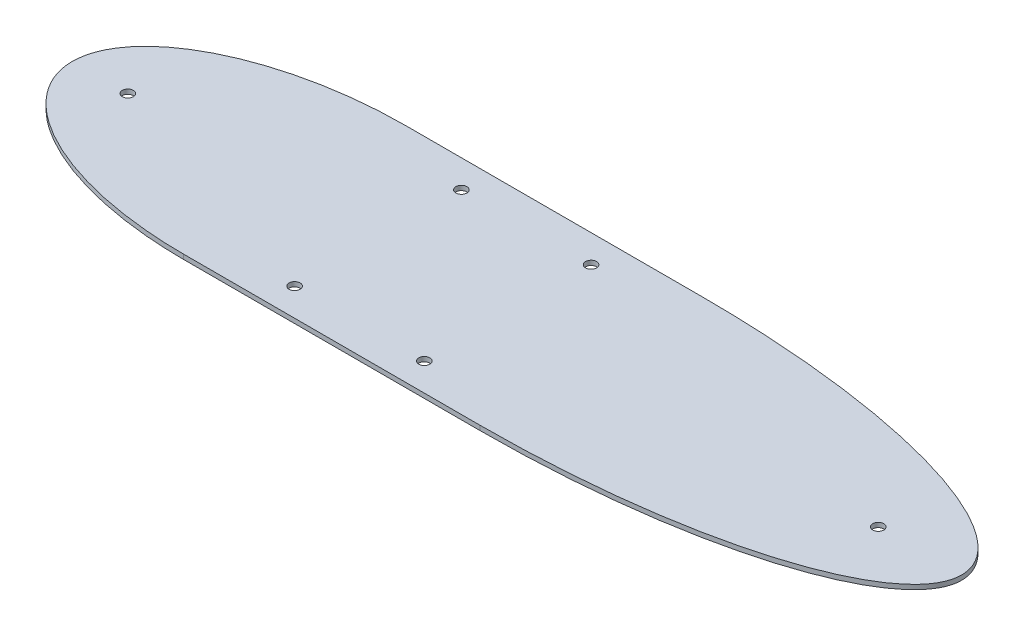
ISO-10303-21;
HEADER;
FILE_DESCRIPTION(('STEP AP214'),'2;1');
FILE_NAME('part.step','',(''),(''),'','','');
FILE_SCHEMA(('AUTOMOTIVE_DESIGN { 1 0 10303 214 1 1 1 1 }'));
ENDSEC;
DATA;
#1=APPLICATION_CONTEXT('core data for automotive mechanical design processes');
#2=APPLICATION_PROTOCOL_DEFINITION('international standard','automotive_design',2000,#1);
#3=PRODUCT_CONTEXT('',#1,'mechanical');
#4=PRODUCT('Part','Part','',(#3));
#5=PRODUCT_RELATED_PRODUCT_CATEGORY('part','',(#4));
#6=PRODUCT_DEFINITION_FORMATION('','',#4);
#7=PRODUCT_DEFINITION_CONTEXT('part definition',#1,'design');
#8=PRODUCT_DEFINITION('design','',#6,#7);
#9=PRODUCT_DEFINITION_SHAPE('','',#8);
#10=(LENGTH_UNIT() NAMED_UNIT(*) SI_UNIT(.MILLI.,.METRE.));
#11=(NAMED_UNIT(*) PLANE_ANGLE_UNIT() SI_UNIT($,.RADIAN.));
#12=(NAMED_UNIT(*) SI_UNIT($,.STERADIAN.) SOLID_ANGLE_UNIT());
#13=UNCERTAINTY_MEASURE_WITH_UNIT(LENGTH_MEASURE(1.E-05),#10,'distance_accuracy_value','');
#14=(GEOMETRIC_REPRESENTATION_CONTEXT(3) GLOBAL_UNCERTAINTY_ASSIGNED_CONTEXT((#13)) GLOBAL_UNIT_ASSIGNED_CONTEXT((#10,
#11,#12)) REPRESENTATION_CONTEXT('',''));
#15=CARTESIAN_POINT('',(0.,0.,0.));
#16=DIRECTION('',(0.,0.,1.));
#17=DIRECTION('',(1.,0.,0.));
#18=AXIS2_PLACEMENT_3D('',#15,#16,#17);
#19=CARTESIAN_POINT('',(177.8,1.5875,38.1));
#20=CARTESIAN_POINT('',(431.8,1.5875,38.1));
#21=CARTESIAN_POINT('',(431.8,1.5875,-38.1));
#22=CARTESIAN_POINT('',(177.8,1.5875,-38.1));
#23=(BOUNDED_CURVE() B_SPLINE_CURVE(3,(#19,#20,#21,#22),.UNSPECIFIED.,.F.,
.F.) B_SPLINE_CURVE_WITH_KNOTS((4,4),(0.,1.),
.UNSPECIFIED.) CURVE() GEOMETRIC_REPRESENTATION_ITEM() RATIONAL_B_SPLINE_CURVE((1.,
0.333333333333333,0.333333333333333,1.)) REPRESENTATION_ITEM(''));
#24=DIRECTION('',(0.,-1.,0.));
#25=VECTOR('',#24,1.);
#26=SURFACE_OF_LINEAR_EXTRUSION('',#23,#25);
#27=CARTESIAN_POINT('',(177.8,0.,38.1));
#28=CARTESIAN_POINT('',(431.8,0.,38.1));
#29=CARTESIAN_POINT('',(431.8,0.,-38.1));
#30=CARTESIAN_POINT('',(177.8,0.,-38.1));
#31=(BOUNDED_CURVE() B_SPLINE_CURVE(3,(#27,#28,#29,#30),.UNSPECIFIED.,.F.,
.F.) B_SPLINE_CURVE_WITH_KNOTS((4,4),(0.,1.),
.UNSPECIFIED.) CURVE() GEOMETRIC_REPRESENTATION_ITEM() RATIONAL_B_SPLINE_CURVE((1.,
0.333333333333333,0.333333333333333,1.)) REPRESENTATION_ITEM(''));
#32=CARTESIAN_POINT('',(177.8,0.,38.1));
#33=VERTEX_POINT('',#32);
#34=CARTESIAN_POINT('',(177.8,0.,-38.1));
#35=VERTEX_POINT('',#34);
#36=EDGE_CURVE('E127',#33,#35,#31,.T.);
#37=ORIENTED_EDGE('',*,*,#36,.T.);
#38=DIRECTION('',(0.,-1.,0.));
#39=VECTOR('',#38,1.);
#40=CARTESIAN_POINT('',(177.8,1.5875,-38.1));
#41=LINE('',#40,#39);
#42=CARTESIAN_POINT('',(177.8,1.5875,-38.1));
#43=VERTEX_POINT('',#42);
#44=EDGE_CURVE('E11',#43,#35,#41,.T.);
#45=ORIENTED_EDGE('',*,*,#44,.F.);
#46=CARTESIAN_POINT('',(177.8,1.5875,38.1));
#47=VERTEX_POINT('',#46);
#48=EDGE_CURVE('E92',#47,#43,#23,.T.);
#49=ORIENTED_EDGE('',*,*,#48,.F.);
#50=DIRECTION('',(0.,-1.,0.));
#51=VECTOR('',#50,1.);
#52=CARTESIAN_POINT('',(177.8,1.5875,38.1));
#53=LINE('',#52,#51);
#54=EDGE_CURVE('E104',#47,#33,#53,.T.);
#55=ORIENTED_EDGE('',*,*,#54,.T.);
#56=EDGE_LOOP('',(#37,#45,#49,#55));
#57=FACE_BOUND('',#56,.T.);
#58=ADVANCED_FACE('F39',(#57),#26,.F.);
#59=CARTESIAN_POINT('',(177.8,1.5875,-38.1));
#60=DIRECTION('',(0.,0.,1.));
#61=DIRECTION('',(1.,0.,0.));
#62=AXIS2_PLACEMENT_3D('',#59,#60,#61);
#63=PLANE('',#62);
#64=DIRECTION('',(-1.,0.,0.));
#65=VECTOR('',#64,1.);
#66=CARTESIAN_POINT('',(177.8,0.,-38.1));
#67=LINE('',#66,#65);
#68=CARTESIAN_POINT('',(76.1999999999997,0.,-38.1));
#69=VERTEX_POINT('',#68);
#70=EDGE_CURVE('E97',#35,#69,#67,.T.);
#71=ORIENTED_EDGE('',*,*,#70,.T.);
#72=DIRECTION('',(0.,-1.,0.));
#73=VECTOR('',#72,1.);
#74=CARTESIAN_POINT('',(76.1999999999997,1.5875,-38.1));
#75=LINE('',#74,#73);
#76=CARTESIAN_POINT('',(76.1999999999997,1.5875,-38.1));
#77=VERTEX_POINT('',#76);
#78=EDGE_CURVE('E49',#77,#69,#75,.T.);
#79=ORIENTED_EDGE('',*,*,#78,.F.);
#80=DIRECTION('',(-1.,0.,0.));
#81=VECTOR('',#80,1.);
#82=CARTESIAN_POINT('',(177.8,1.5875,-38.1));
#83=LINE('',#82,#81);
#84=EDGE_CURVE('E87',#43,#77,#83,.T.);
#85=ORIENTED_EDGE('',*,*,#84,.F.);
#86=ORIENTED_EDGE('',*,*,#44,.T.);
#87=EDGE_LOOP('',(#71,#79,#85,#86));
#88=FACE_BOUND('',#87,.T.);
#89=ADVANCED_FACE('F96',(#88),#63,.F.);
#90=CARTESIAN_POINT('',(76.1999999999997,1.5875,-38.1));
#91=CARTESIAN_POINT('',(-76.1999999999984,1.5875,-38.0999999999997));
#92=CARTESIAN_POINT('',(-76.1999999999984,1.5875,38.0999999999997));
#93=CARTESIAN_POINT('',(76.1999999999997,1.5875,38.1));
#94=(BOUNDED_CURVE() B_SPLINE_CURVE(3,(#90,#91,#92,#93),.UNSPECIFIED.,.F.,
.F.) B_SPLINE_CURVE_WITH_KNOTS((4,4),(0.,1.),
.UNSPECIFIED.) CURVE() GEOMETRIC_REPRESENTATION_ITEM() RATIONAL_B_SPLINE_CURVE((1.,
0.333333333333335,0.333333333333335,1.)) REPRESENTATION_ITEM(''));
#95=DIRECTION('',(0.,-1.,0.));
#96=VECTOR('',#95,1.);
#97=SURFACE_OF_LINEAR_EXTRUSION('',#94,#96);
#98=CARTESIAN_POINT('',(76.1999999999997,0.,-38.1));
#99=CARTESIAN_POINT('',(-76.1999999999984,0.,-38.0999999999997));
#100=CARTESIAN_POINT('',(-76.1999999999984,0.,38.0999999999997));
#101=CARTESIAN_POINT('',(76.1999999999997,0.,38.1));
#102=(BOUNDED_CURVE() B_SPLINE_CURVE(3,(#98,#99,#100,#101),.UNSPECIFIED.,.F.,
.F.) B_SPLINE_CURVE_WITH_KNOTS((4,4),(0.,1.),
.UNSPECIFIED.) CURVE() GEOMETRIC_REPRESENTATION_ITEM() RATIONAL_B_SPLINE_CURVE((1.,
0.333333333333335,0.333333333333335,1.)) REPRESENTATION_ITEM(''));
#103=CARTESIAN_POINT('',(76.1999999999997,0.,38.1));
#104=VERTEX_POINT('',#103);
#105=EDGE_CURVE('E74',#69,#104,#102,.T.);
#106=ORIENTED_EDGE('',*,*,#105,.T.);
#107=DIRECTION('',(0.,-1.,0.));
#108=VECTOR('',#107,1.);
#109=CARTESIAN_POINT('',(76.1999999999997,1.5875,38.1));
#110=LINE('',#109,#108);
#111=CARTESIAN_POINT('',(76.1999999999997,1.5875,38.1));
#112=VERTEX_POINT('',#111);
#113=EDGE_CURVE('E99',#112,#104,#110,.T.);
#114=ORIENTED_EDGE('',*,*,#113,.F.);
#115=EDGE_CURVE('E90',#77,#112,#94,.T.);
#116=ORIENTED_EDGE('',*,*,#115,.F.);
#117=ORIENTED_EDGE('',*,*,#78,.T.);
#118=EDGE_LOOP('',(#106,#114,#116,#117));
#119=FACE_BOUND('',#118,.T.);
#120=ADVANCED_FACE('F100',(#119),#97,.F.);
#121=CARTESIAN_POINT('',(76.1999999999997,1.5875,38.1));
#122=DIRECTION('',(0.,0.,-1.));
#123=DIRECTION('',(-1.,0.,0.));
#124=AXIS2_PLACEMENT_3D('',#121,#122,#123);
#125=PLANE('',#124);
#126=DIRECTION('',(1.,0.,0.));
#127=VECTOR('',#126,1.);
#128=CARTESIAN_POINT('',(76.1999999999997,0.,38.1));
#129=LINE('',#128,#127);
#130=EDGE_CURVE('E80',#104,#33,#129,.T.);
#131=ORIENTED_EDGE('',*,*,#130,.T.);
#132=ORIENTED_EDGE('',*,*,#54,.F.);
#133=DIRECTION('',(1.,0.,0.));
#134=VECTOR('',#133,1.);
#135=CARTESIAN_POINT('',(76.1999999999997,1.5875,38.1));
#136=LINE('',#135,#134);
#137=EDGE_CURVE('E57',#112,#47,#136,.T.);
#138=ORIENTED_EDGE('',*,*,#137,.F.);
#139=ORIENTED_EDGE('',*,*,#113,.T.);
#140=EDGE_LOOP('',(#131,#132,#138,#139));
#141=FACE_BOUND('',#140,.T.);
#142=ADVANCED_FACE('F116',(#141),#125,.F.);
#143=CARTESIAN_POINT('',(304.8,1.5875,0.));
#144=DIRECTION('',(0.,-1.,0.));
#145=DIRECTION('',(0.,0.,-1.));
#146=AXIS2_PLACEMENT_3D('',#143,#144,#145);
#147=PLANE('',#146);
#148=CARTESIAN_POINT('',(276.225,1.5875,0.));
#149=DIRECTION('',(0.,-1.,0.));
#150=DIRECTION('',(0.,0.,-1.));
#151=AXIS2_PLACEMENT_3D('',#148,#149,#150);
#152=CIRCLE('',#151,1.89865);
#153=CARTESIAN_POINT('',(276.225,1.5875,-1.89865));
#154=VERTEX_POINT('',#153);
#155=EDGE_CURVE('E196',#154,#154,#152,.T.);
#156=ORIENTED_EDGE('',*,*,#155,.T.);
#157=EDGE_LOOP('',(#156));
#158=FACE_BOUND('',#157,.T.);
#159=CARTESIAN_POINT('',(19.05,1.5875,0.));
#160=DIRECTION('',(0.,-1.,0.));
#161=DIRECTION('',(0.,0.,-1.));
#162=AXIS2_PLACEMENT_3D('',#159,#160,#161);
#163=CIRCLE('',#162,1.89865);
#164=CARTESIAN_POINT('',(19.05,1.5875,-1.89865));
#165=VERTEX_POINT('',#164);
#166=EDGE_CURVE('E203',#165,#165,#163,.T.);
#167=ORIENTED_EDGE('',*,*,#166,.T.);
#168=EDGE_LOOP('',(#167));
#169=FACE_BOUND('',#168,.T.);
#170=CARTESIAN_POINT('',(104.775,1.5875,28.575));
#171=DIRECTION('',(0.,-1.,0.));
#172=DIRECTION('',(0.,0.,-1.));
#173=AXIS2_PLACEMENT_3D('',#170,#171,#172);
#174=CIRCLE('',#173,1.89865);
#175=CARTESIAN_POINT('',(104.775,1.5875,26.67635));
#176=VERTEX_POINT('',#175);
#177=EDGE_CURVE('E214',#176,#176,#174,.T.);
#178=ORIENTED_EDGE('',*,*,#177,.T.);
#179=EDGE_LOOP('',(#178));
#180=FACE_BOUND('',#179,.T.);
#181=CARTESIAN_POINT('',(149.225,1.5875,28.575));
#182=DIRECTION('',(0.,-1.,0.));
#183=DIRECTION('',(0.,0.,-1.));
#184=AXIS2_PLACEMENT_3D('',#181,#182,#183);
#185=CIRCLE('',#184,1.89865);
#186=CARTESIAN_POINT('',(149.225,1.5875,26.67635));
#187=VERTEX_POINT('',#186);
#188=EDGE_CURVE('E222',#187,#187,#185,.T.);
#189=ORIENTED_EDGE('',*,*,#188,.T.);
#190=EDGE_LOOP('',(#189));
#191=FACE_BOUND('',#190,.T.);
#192=CARTESIAN_POINT('',(149.225,1.5875,-28.575));
#193=DIRECTION('',(0.,-1.,0.));
#194=DIRECTION('',(0.,0.,-1.));
#195=AXIS2_PLACEMENT_3D('',#192,#193,#194);
#196=CIRCLE('',#195,1.89865);
#197=CARTESIAN_POINT('',(149.225,1.5875,-30.47365));
#198=VERTEX_POINT('',#197);
#199=EDGE_CURVE('E230',#198,#198,#196,.T.);
#200=ORIENTED_EDGE('',*,*,#199,.T.);
#201=EDGE_LOOP('',(#200));
#202=FACE_BOUND('',#201,.T.);
#203=CARTESIAN_POINT('',(104.775,1.5875,-28.575));
#204=DIRECTION('',(0.,-1.,0.));
#205=DIRECTION('',(0.,0.,-1.));
#206=AXIS2_PLACEMENT_3D('',#203,#204,#205);
#207=CIRCLE('',#206,1.89865);
#208=CARTESIAN_POINT('',(104.775,1.5875,-30.47365));
#209=VERTEX_POINT('',#208);
#210=EDGE_CURVE('E130',#209,#209,#207,.T.);
#211=ORIENTED_EDGE('',*,*,#210,.T.);
#212=EDGE_LOOP('',(#211));
#213=FACE_BOUND('',#212,.T.);
#214=ORIENTED_EDGE('',*,*,#48,.T.);
#215=ORIENTED_EDGE('',*,*,#84,.T.);
#216=ORIENTED_EDGE('',*,*,#115,.T.);
#217=ORIENTED_EDGE('',*,*,#137,.T.);
#218=EDGE_LOOP('',(#214,#215,#216,#217));
#219=FACE_BOUND('',#218,.T.);
#220=ADVANCED_FACE('F88',(#158,#169,#180,#191,#202,#213,#219),#147,.F.);
#221=CARTESIAN_POINT('',(304.8,0.,0.));
#222=DIRECTION('',(0.,-1.,0.));
#223=DIRECTION('',(0.,0.,-1.));
#224=AXIS2_PLACEMENT_3D('',#221,#222,#223);
#225=PLANE('',#224);
#226=CARTESIAN_POINT('',(276.225,0.,0.));
#227=DIRECTION('',(0.,-1.,0.));
#228=DIRECTION('',(0.,0.,-1.));
#229=AXIS2_PLACEMENT_3D('',#226,#227,#228);
#230=CIRCLE('',#229,1.89865);
#231=CARTESIAN_POINT('',(276.225,0.,-1.89865));
#232=VERTEX_POINT('',#231);
#233=EDGE_CURVE('E193',#232,#232,#230,.T.);
#234=ORIENTED_EDGE('',*,*,#233,.F.);
#235=EDGE_LOOP('',(#234));
#236=FACE_BOUND('',#235,.T.);
#237=CARTESIAN_POINT('',(19.05,0.,0.));
#238=DIRECTION('',(0.,-1.,0.));
#239=DIRECTION('',(0.,0.,-1.));
#240=AXIS2_PLACEMENT_3D('',#237,#238,#239);
#241=CIRCLE('',#240,1.89865);
#242=CARTESIAN_POINT('',(19.05,0.,-1.89865));
#243=VERTEX_POINT('',#242);
#244=EDGE_CURVE('E198',#243,#243,#241,.T.);
#245=ORIENTED_EDGE('',*,*,#244,.F.);
#246=EDGE_LOOP('',(#245));
#247=FACE_BOUND('',#246,.T.);
#248=CARTESIAN_POINT('',(104.775,0.,28.575));
#249=DIRECTION('',(0.,-1.,0.));
#250=DIRECTION('',(0.,0.,-1.));
#251=AXIS2_PLACEMENT_3D('',#248,#249,#250);
#252=CIRCLE('',#251,1.89865);
#253=CARTESIAN_POINT('',(104.775,0.,26.67635));
#254=VERTEX_POINT('',#253);
#255=EDGE_CURVE('E210',#254,#254,#252,.T.);
#256=ORIENTED_EDGE('',*,*,#255,.F.);
#257=EDGE_LOOP('',(#256));
#258=FACE_BOUND('',#257,.T.);
#259=CARTESIAN_POINT('',(149.225,0.,28.575));
#260=DIRECTION('',(0.,-1.,0.));
#261=DIRECTION('',(0.,0.,-1.));
#262=AXIS2_PLACEMENT_3D('',#259,#260,#261);
#263=CIRCLE('',#262,1.89865);
#264=CARTESIAN_POINT('',(149.225,0.,26.67635));
#265=VERTEX_POINT('',#264);
#266=EDGE_CURVE('E218',#265,#265,#263,.T.);
#267=ORIENTED_EDGE('',*,*,#266,.F.);
#268=EDGE_LOOP('',(#267));
#269=FACE_BOUND('',#268,.T.);
#270=CARTESIAN_POINT('',(149.225,0.,-28.575));
#271=DIRECTION('',(0.,-1.,0.));
#272=DIRECTION('',(0.,0.,-1.));
#273=AXIS2_PLACEMENT_3D('',#270,#271,#272);
#274=CIRCLE('',#273,1.89865);
#275=CARTESIAN_POINT('',(149.225,0.,-30.47365));
#276=VERTEX_POINT('',#275);
#277=EDGE_CURVE('E226',#276,#276,#274,.T.);
#278=ORIENTED_EDGE('',*,*,#277,.F.);
#279=EDGE_LOOP('',(#278));
#280=FACE_BOUND('',#279,.T.);
#281=CARTESIAN_POINT('',(104.775,0.,-28.575));
#282=DIRECTION('',(0.,-1.,0.));
#283=DIRECTION('',(0.,0.,-1.));
#284=AXIS2_PLACEMENT_3D('',#281,#282,#283);
#285=CIRCLE('',#284,1.89865);
#286=CARTESIAN_POINT('',(104.775,0.,-30.47365));
#287=VERTEX_POINT('',#286);
#288=EDGE_CURVE('E135',#287,#287,#285,.T.);
#289=ORIENTED_EDGE('',*,*,#288,.F.);
#290=EDGE_LOOP('',(#289));
#291=FACE_BOUND('',#290,.T.);
#292=ORIENTED_EDGE('',*,*,#36,.F.);
#293=ORIENTED_EDGE('',*,*,#130,.F.);
#294=ORIENTED_EDGE('',*,*,#105,.F.);
#295=ORIENTED_EDGE('',*,*,#70,.F.);
#296=EDGE_LOOP('',(#292,#293,#294,#295));
#297=FACE_BOUND('',#296,.T.);
#298=ADVANCED_FACE('F155',(#236,#247,#258,#269,#280,#291,#297),#225,.T.);
#299=CARTESIAN_POINT('',(104.775,0.,-28.575));
#300=DIRECTION('',(0.,-1.,0.));
#301=DIRECTION('',(0.,0.,-1.));
#302=AXIS2_PLACEMENT_3D('',#299,#300,#301);
#303=CYLINDRICAL_SURFACE('',#302,1.89865);
#304=ORIENTED_EDGE('',*,*,#210,.F.);
#305=EDGE_LOOP('',(#304));
#306=FACE_BOUND('',#305,.T.);
#307=ORIENTED_EDGE('',*,*,#288,.T.);
#308=EDGE_LOOP('',(#307));
#309=FACE_BOUND('',#308,.T.);
#310=ADVANCED_FACE('F157',(#306,#309),#303,.F.);
#311=CARTESIAN_POINT('',(149.225,0.,-28.575));
#312=DIRECTION('',(0.,-1.,0.));
#313=DIRECTION('',(0.,0.,-1.));
#314=AXIS2_PLACEMENT_3D('',#311,#312,#313);
#315=CYLINDRICAL_SURFACE('',#314,1.89865);
#316=ORIENTED_EDGE('',*,*,#199,.F.);
#317=EDGE_LOOP('',(#316));
#318=FACE_BOUND('',#317,.T.);
#319=ORIENTED_EDGE('',*,*,#277,.T.);
#320=EDGE_LOOP('',(#319));
#321=FACE_BOUND('',#320,.T.);
#322=ADVANCED_FACE('F163',(#318,#321),#315,.F.);
#323=CARTESIAN_POINT('',(149.225,0.,28.575));
#324=DIRECTION('',(0.,-1.,0.));
#325=DIRECTION('',(0.,0.,-1.));
#326=AXIS2_PLACEMENT_3D('',#323,#324,#325);
#327=CYLINDRICAL_SURFACE('',#326,1.89865);
#328=ORIENTED_EDGE('',*,*,#188,.F.);
#329=EDGE_LOOP('',(#328));
#330=FACE_BOUND('',#329,.T.);
#331=ORIENTED_EDGE('',*,*,#266,.T.);
#332=EDGE_LOOP('',(#331));
#333=FACE_BOUND('',#332,.T.);
#334=ADVANCED_FACE('F173',(#330,#333),#327,.F.);
#335=CARTESIAN_POINT('',(104.775,0.,28.575));
#336=DIRECTION('',(0.,-1.,0.));
#337=DIRECTION('',(0.,0.,-1.));
#338=AXIS2_PLACEMENT_3D('',#335,#336,#337);
#339=CYLINDRICAL_SURFACE('',#338,1.89865);
#340=ORIENTED_EDGE('',*,*,#177,.F.);
#341=EDGE_LOOP('',(#340));
#342=FACE_BOUND('',#341,.T.);
#343=ORIENTED_EDGE('',*,*,#255,.T.);
#344=EDGE_LOOP('',(#343));
#345=FACE_BOUND('',#344,.T.);
#346=ADVANCED_FACE('F177',(#342,#345),#339,.F.);
#347=CARTESIAN_POINT('',(19.05,0.,0.));
#348=DIRECTION('',(0.,-1.,0.));
#349=DIRECTION('',(0.,0.,-1.));
#350=AXIS2_PLACEMENT_3D('',#347,#348,#349);
#351=CYLINDRICAL_SURFACE('',#350,1.89865);
#352=ORIENTED_EDGE('',*,*,#244,.T.);
#353=EDGE_LOOP('',(#352));
#354=FACE_BOUND('',#353,.T.);
#355=ORIENTED_EDGE('',*,*,#166,.F.);
#356=EDGE_LOOP('',(#355));
#357=FACE_BOUND('',#356,.T.);
#358=ADVANCED_FACE('F181',(#354,#357),#351,.F.);
#359=CARTESIAN_POINT('',(276.225,0.,0.));
#360=DIRECTION('',(0.,-1.,0.));
#361=DIRECTION('',(0.,0.,-1.));
#362=AXIS2_PLACEMENT_3D('',#359,#360,#361);
#363=CYLINDRICAL_SURFACE('',#362,1.89865);
#364=ORIENTED_EDGE('',*,*,#233,.T.);
#365=EDGE_LOOP('',(#364));
#366=FACE_BOUND('',#365,.T.);
#367=ORIENTED_EDGE('',*,*,#155,.F.);
#368=EDGE_LOOP('',(#367));
#369=FACE_BOUND('',#368,.T.);
#370=ADVANCED_FACE('F185',(#366,#369),#363,.F.);
#371=CLOSED_SHELL('',(#58,#89,#120,#142,#220,#298,#310,#322,#334,#346,#358,#370));
#372=MANIFOLD_SOLID_BREP('B2',#371);
#373=ADVANCED_BREP_SHAPE_REPRESENTATION('',(#18,#372),#14);
#374=SHAPE_DEFINITION_REPRESENTATION(#9,#373);
ENDSEC;
END-ISO-10303-21;
